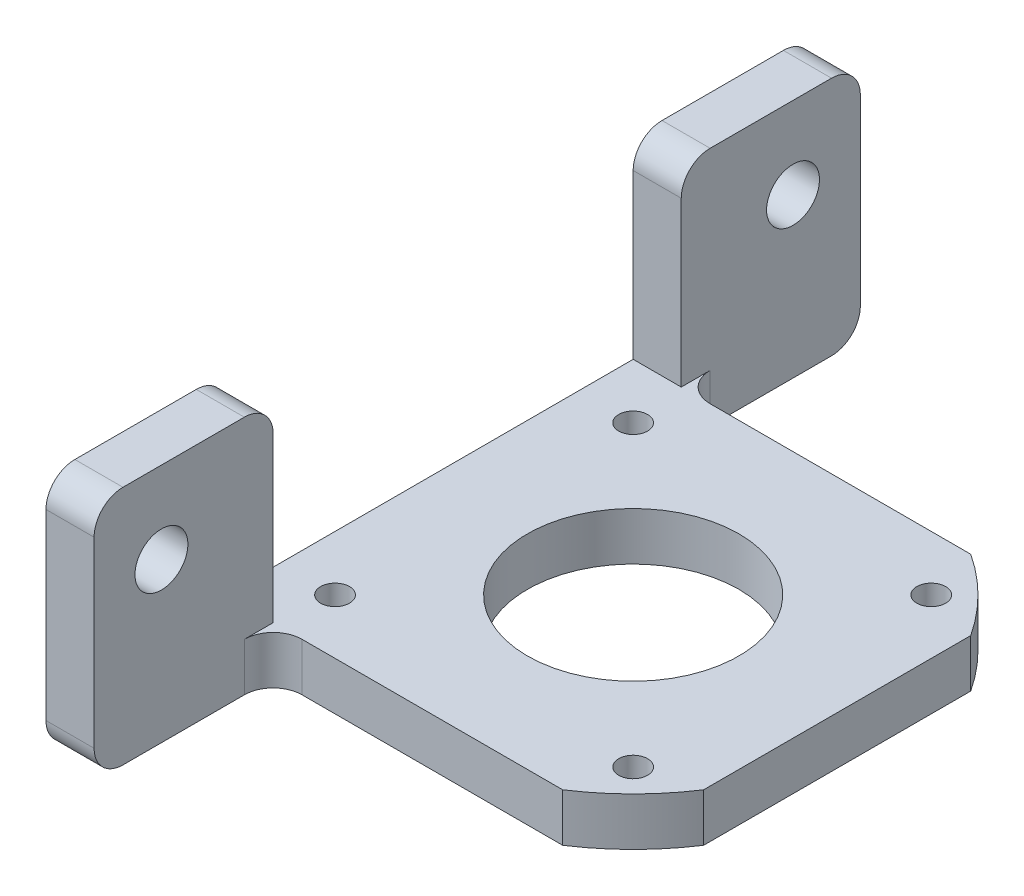
ISO-10303-21;
HEADER;
FILE_DESCRIPTION(('STEP AP214'),'2;1');
FILE_NAME('part.step','',(''),(''),'','','');
FILE_SCHEMA(('AUTOMOTIVE_DESIGN { 1 0 10303 214 1 1 1 1 }'));
ENDSEC;
DATA;
#1=APPLICATION_CONTEXT('core data for automotive mechanical design processes');
#2=APPLICATION_PROTOCOL_DEFINITION('international standard','automotive_design',2000,#1);
#3=PRODUCT_CONTEXT('',#1,'mechanical');
#4=PRODUCT('Part','Part','',(#3));
#5=PRODUCT_RELATED_PRODUCT_CATEGORY('part','',(#4));
#6=PRODUCT_DEFINITION_FORMATION('','',#4);
#7=PRODUCT_DEFINITION_CONTEXT('part definition',#1,'design');
#8=PRODUCT_DEFINITION('design','',#6,#7);
#9=PRODUCT_DEFINITION_SHAPE('','',#8);
#10=(LENGTH_UNIT() NAMED_UNIT(*) SI_UNIT(.MILLI.,.METRE.));
#11=(NAMED_UNIT(*) PLANE_ANGLE_UNIT() SI_UNIT($,.RADIAN.));
#12=(NAMED_UNIT(*) SI_UNIT($,.STERADIAN.) SOLID_ANGLE_UNIT());
#13=UNCERTAINTY_MEASURE_WITH_UNIT(LENGTH_MEASURE(1.E-05),#10,'distance_accuracy_value','');
#14=(GEOMETRIC_REPRESENTATION_CONTEXT(3) GLOBAL_UNCERTAINTY_ASSIGNED_CONTEXT((#13)) GLOBAL_UNIT_ASSIGNED_CONTEXT((#10,
#11,#12)) REPRESENTATION_CONTEXT('',''));
#15=CARTESIAN_POINT('',(0.,0.,0.));
#16=DIRECTION('',(0.,0.,1.));
#17=DIRECTION('',(1.,0.,0.));
#18=AXIS2_PLACEMENT_3D('',#15,#16,#17);
#19=CARTESIAN_POINT('',(-21.209,5.,-21.209));
#20=DIRECTION('',(0.,0.,-1.));
#21=DIRECTION('',(-1.,0.,0.));
#22=AXIS2_PLACEMENT_3D('',#19,#20,#21);
#23=PLANE('',#22);
#24=DIRECTION('',(1.,0.,0.));
#25=VECTOR('',#24,1.);
#26=CARTESIAN_POINT('',(-21.209,0.,-21.209));
#27=LINE('',#26,#25);
#28=CARTESIAN_POINT('',(-13.209,0.,-21.209));
#29=VERTEX_POINT('',#28);
#30=CARTESIAN_POINT('',(13.8838128639074,0.,-21.209));
#31=VERTEX_POINT('',#30);
#32=EDGE_CURVE('E308',#29,#31,#27,.T.);
#33=ORIENTED_EDGE('',*,*,#32,.F.);
#34=DIRECTION('',(0.,1.,0.));
#35=VECTOR('',#34,1.);
#36=CARTESIAN_POINT('',(-13.209,5.,-21.209));
#37=LINE('',#36,#35);
#38=CARTESIAN_POINT('',(-13.209,5.,-21.209));
#39=VERTEX_POINT('',#38);
#40=EDGE_CURVE('E338',#29,#39,#37,.T.);
#41=ORIENTED_EDGE('',*,*,#40,.T.);
#42=DIRECTION('',(-1.,0.,0.));
#43=VECTOR('',#42,1.);
#44=CARTESIAN_POINT('',(13.8838128639074,5.,-21.209));
#45=LINE('',#44,#43);
#46=CARTESIAN_POINT('',(13.8838128639074,5.,-21.209));
#47=VERTEX_POINT('',#46);
#48=EDGE_CURVE('E214',#47,#39,#45,.T.);
#49=ORIENTED_EDGE('',*,*,#48,.F.);
#50=DIRECTION('',(0.,-1.,0.));
#51=VECTOR('',#50,1.);
#52=CARTESIAN_POINT('',(13.8838128639074,5.,-21.209));
#53=LINE('',#52,#51);
#54=EDGE_CURVE('E334',#47,#31,#53,.T.);
#55=ORIENTED_EDGE('',*,*,#54,.T.);
#56=EDGE_LOOP('',(#33,#41,#49,#55));
#57=FACE_BOUND('',#56,.T.);
#58=ADVANCED_FACE('F39',(#57),#23,.T.);
#59=CARTESIAN_POINT('',(0.,5.,0.));
#60=DIRECTION('',(0.,-1.,0.));
#61=DIRECTION('',(0.,0.,-1.));
#62=AXIS2_PLACEMENT_3D('',#59,#60,#61);
#63=CYLINDRICAL_SURFACE('',#62,25.3492);
#64=CARTESIAN_POINT('',(0.,0.,0.));
#65=DIRECTION('',(0.,1.,0.));
#66=DIRECTION('',(0.,0.,1.));
#67=AXIS2_PLACEMENT_3D('',#64,#65,#66);
#68=CIRCLE('',#67,25.3492);
#69=CARTESIAN_POINT('',(21.209,0.,-13.8838128639074));
#70=VERTEX_POINT('',#69);
#71=EDGE_CURVE('E283',#70,#31,#68,.T.);
#72=ORIENTED_EDGE('',*,*,#71,.T.);
#73=ORIENTED_EDGE('',*,*,#54,.F.);
#74=CARTESIAN_POINT('',(0.,5.,0.));
#75=DIRECTION('',(0.,1.,0.));
#76=DIRECTION('',(0.,0.,1.));
#77=AXIS2_PLACEMENT_3D('',#74,#75,#76);
#78=CIRCLE('',#77,25.3492);
#79=CARTESIAN_POINT('',(21.209,5.,-13.8838128639074));
#80=VERTEX_POINT('',#79);
#81=EDGE_CURVE('E287',#80,#47,#78,.T.);
#82=ORIENTED_EDGE('',*,*,#81,.F.);
#83=DIRECTION('',(0.,-1.,0.));
#84=VECTOR('',#83,1.);
#85=CARTESIAN_POINT('',(21.209,5.,-13.8838128639074));
#86=LINE('',#85,#84);
#87=EDGE_CURVE('E304',#80,#70,#86,.T.);
#88=ORIENTED_EDGE('',*,*,#87,.T.);
#89=EDGE_LOOP('',(#72,#73,#82,#88));
#90=FACE_BOUND('',#89,.T.);
#91=ADVANCED_FACE('F486',(#90),#63,.T.);
#92=CARTESIAN_POINT('',(-21.209,5.,21.209));
#93=DIRECTION('',(-1.,0.,0.));
#94=DIRECTION('',(0.,0.,1.));
#95=AXIS2_PLACEMENT_3D('',#92,#93,#94);
#96=PLANE('',#95);
#97=CARTESIAN_POINT('',(-21.209,16.5,-32.829));
#98=DIRECTION('',(-1.,0.,0.));
#99=DIRECTION('',(0.,0.,1.));
#100=AXIS2_PLACEMENT_3D('',#97,#98,#99);
#101=CIRCLE('',#100,2.75);
#102=CARTESIAN_POINT('',(-21.209,16.5,-30.079));
#103=VERTEX_POINT('',#102);
#104=EDGE_CURVE('E551',#103,#103,#101,.T.);
#105=ORIENTED_EDGE('',*,*,#104,.F.);
#106=EDGE_LOOP('',(#105));
#107=FACE_BOUND('',#106,.T.);
#108=CARTESIAN_POINT('',(-21.209,16.5,32.829));
#109=DIRECTION('',(-1.,0.,0.));
#110=DIRECTION('',(0.,0.,1.));
#111=AXIS2_PLACEMENT_3D('',#108,#109,#110);
#112=CIRCLE('',#111,2.75);
#113=CARTESIAN_POINT('',(-21.209,16.5,35.579));
#114=VERTEX_POINT('',#113);
#115=EDGE_CURVE('E228',#114,#114,#112,.F.);
#116=ORIENTED_EDGE('',*,*,#115,.T.);
#117=EDGE_LOOP('',(#116));
#118=FACE_BOUND('',#117,.T.);
#119=DIRECTION('',(0.,-1.,0.));
#120=VECTOR('',#119,1.);
#121=CARTESIAN_POINT('',(-21.209,25.,-21.209));
#122=LINE('',#121,#120);
#123=CARTESIAN_POINT('',(-21.209,22.,-21.209));
#124=VERTEX_POINT('',#123);
#125=CARTESIAN_POINT('',(-21.209,5.,-21.209));
#126=VERTEX_POINT('',#125);
#127=EDGE_CURVE('E541',#124,#126,#122,.T.);
#128=ORIENTED_EDGE('',*,*,#127,.F.);
#129=CARTESIAN_POINT('',(-21.209,22.,-24.209));
#130=DIRECTION('',(-1.,0.,0.));
#131=DIRECTION('',(0.,0.,1.));
#132=AXIS2_PLACEMENT_3D('',#129,#130,#131);
#133=CIRCLE('',#132,3.);
#134=CARTESIAN_POINT('',(-21.209,25.,-24.209));
#135=VERTEX_POINT('',#134);
#136=EDGE_CURVE('E393',#124,#135,#133,.T.);
#137=ORIENTED_EDGE('',*,*,#136,.T.);
#138=DIRECTION('',(0.,0.,-1.));
#139=VECTOR('',#138,1.);
#140=CARTESIAN_POINT('',(-21.209,25.,-21.209));
#141=LINE('',#140,#139);
#142=CARTESIAN_POINT('',(-21.209,25.,-36.829));
#143=VERTEX_POINT('',#142);
#144=EDGE_CURVE('E547',#135,#143,#141,.T.);
#145=ORIENTED_EDGE('',*,*,#144,.T.);
#146=CARTESIAN_POINT('',(-21.209,22.,-36.829));
#147=DIRECTION('',(-1.,0.,0.));
#148=DIRECTION('',(0.,0.,1.));
#149=AXIS2_PLACEMENT_3D('',#146,#147,#148);
#150=CIRCLE('',#149,3.);
#151=CARTESIAN_POINT('',(-21.209,22.,-39.829));
#152=VERTEX_POINT('',#151);
#153=EDGE_CURVE('E390',#143,#152,#150,.T.);
#154=ORIENTED_EDGE('',*,*,#153,.T.);
#155=DIRECTION('',(0.,-1.,0.));
#156=VECTOR('',#155,1.);
#157=CARTESIAN_POINT('',(-21.209,5.,-39.829));
#158=LINE('',#157,#156);
#159=CARTESIAN_POINT('',(-21.209,3.,-39.829));
#160=VERTEX_POINT('',#159);
#161=EDGE_CURVE('E521',#152,#160,#158,.T.);
#162=ORIENTED_EDGE('',*,*,#161,.T.);
#163=CARTESIAN_POINT('',(-21.209,3.,-36.829));
#164=DIRECTION('',(-1.,0.,0.));
#165=DIRECTION('',(0.,0.,1.));
#166=AXIS2_PLACEMENT_3D('',#163,#164,#165);
#167=CIRCLE('',#166,3.);
#168=CARTESIAN_POINT('',(-21.209,0.,-36.829));
#169=VERTEX_POINT('',#168);
#170=EDGE_CURVE('E387',#160,#169,#167,.T.);
#171=ORIENTED_EDGE('',*,*,#170,.T.);
#172=DIRECTION('',(0.,0.,-1.));
#173=VECTOR('',#172,1.);
#174=CARTESIAN_POINT('',(-21.209,0.,21.209));
#175=LINE('',#174,#173);
#176=CARTESIAN_POINT('',(-21.209,0.,36.829));
#177=VERTEX_POINT('',#176);
#178=EDGE_CURVE('E311',#177,#169,#175,.T.);
#179=ORIENTED_EDGE('',*,*,#178,.F.);
#180=CARTESIAN_POINT('',(-21.209,3.,36.829));
#181=DIRECTION('',(-1.,0.,0.));
#182=DIRECTION('',(0.,0.,1.));
#183=AXIS2_PLACEMENT_3D('',#180,#181,#182);
#184=CIRCLE('',#183,3.);
#185=CARTESIAN_POINT('',(-21.209,3.,39.829));
#186=VERTEX_POINT('',#185);
#187=EDGE_CURVE('E384',#177,#186,#184,.T.);
#188=ORIENTED_EDGE('',*,*,#187,.T.);
#189=DIRECTION('',(0.,-1.,0.));
#190=VECTOR('',#189,1.);
#191=CARTESIAN_POINT('',(-21.209,5.,39.829));
#192=LINE('',#191,#190);
#193=CARTESIAN_POINT('',(-21.209,22.,39.829));
#194=VERTEX_POINT('',#193);
#195=EDGE_CURVE('E234',#194,#186,#192,.T.);
#196=ORIENTED_EDGE('',*,*,#195,.F.);
#197=CARTESIAN_POINT('',(-21.209,22.,36.829));
#198=DIRECTION('',(-1.,0.,0.));
#199=DIRECTION('',(0.,0.,1.));
#200=AXIS2_PLACEMENT_3D('',#197,#198,#199);
#201=CIRCLE('',#200,3.);
#202=CARTESIAN_POINT('',(-21.209,25.,36.829));
#203=VERTEX_POINT('',#202);
#204=EDGE_CURVE('E379',#194,#203,#201,.T.);
#205=ORIENTED_EDGE('',*,*,#204,.T.);
#206=DIRECTION('',(0.,0.,1.));
#207=VECTOR('',#206,1.);
#208=CARTESIAN_POINT('',(-21.209,25.,21.209));
#209=LINE('',#208,#207);
#210=CARTESIAN_POINT('',(-21.209,25.,24.209));
#211=VERTEX_POINT('',#210);
#212=EDGE_CURVE('E203',#211,#203,#209,.T.);
#213=ORIENTED_EDGE('',*,*,#212,.F.);
#214=CARTESIAN_POINT('',(-21.209,22.,24.209));
#215=DIRECTION('',(-1.,0.,0.));
#216=DIRECTION('',(0.,0.,1.));
#217=AXIS2_PLACEMENT_3D('',#214,#215,#216);
#218=CIRCLE('',#217,3.);
#219=CARTESIAN_POINT('',(-21.209,22.,21.209));
#220=VERTEX_POINT('',#219);
#221=EDGE_CURVE('E197',#211,#220,#218,.T.);
#222=ORIENTED_EDGE('',*,*,#221,.T.);
#223=DIRECTION('',(0.,-1.,0.));
#224=VECTOR('',#223,1.);
#225=CARTESIAN_POINT('',(-21.209,25.,21.209));
#226=LINE('',#225,#224);
#227=CARTESIAN_POINT('',(-21.209,5.,21.209));
#228=VERTEX_POINT('',#227);
#229=EDGE_CURVE('E191',#220,#228,#226,.T.);
#230=ORIENTED_EDGE('',*,*,#229,.T.);
#231=DIRECTION('',(0.,0.,-1.));
#232=VECTOR('',#231,1.);
#233=CARTESIAN_POINT('',(-21.209,5.,-13.8838128639074));
#234=LINE('',#233,#232);
#235=EDGE_CURVE('E195',#228,#126,#234,.T.);
#236=ORIENTED_EDGE('',*,*,#235,.T.);
#237=EDGE_LOOP('',(#128,#137,#145,#154,#162,#171,#179,#188,#196,#205,#213,#222,#230,#236));
#238=FACE_BOUND('',#237,.T.);
#239=ADVANCED_FACE('F194',(#107,#118,#238),#96,.T.);
#240=CARTESIAN_POINT('',(13.8838128639074,5.,21.209));
#241=DIRECTION('',(0.,0.,1.));
#242=DIRECTION('',(1.,0.,0.));
#243=AXIS2_PLACEMENT_3D('',#240,#241,#242);
#244=PLANE('',#243);
#245=DIRECTION('',(-1.,0.,0.));
#246=VECTOR('',#245,1.);
#247=CARTESIAN_POINT('',(-13.8838128639074,5.,21.209));
#248=LINE('',#247,#246);
#249=CARTESIAN_POINT('',(13.8838128639074,5.,21.209));
#250=VERTEX_POINT('',#249);
#251=CARTESIAN_POINT('',(-13.209,5.,21.209));
#252=VERTEX_POINT('',#251);
#253=EDGE_CURVE('E213',#250,#252,#248,.T.);
#254=ORIENTED_EDGE('',*,*,#253,.T.);
#255=DIRECTION('',(0.,1.,0.));
#256=VECTOR('',#255,1.);
#257=CARTESIAN_POINT('',(-13.209,5.,21.209));
#258=LINE('',#257,#256);
#259=CARTESIAN_POINT('',(-13.209,0.,21.209));
#260=VERTEX_POINT('',#259);
#261=EDGE_CURVE('E372',#252,#260,#258,.F.);
#262=ORIENTED_EDGE('',*,*,#261,.T.);
#263=DIRECTION('',(-1.,0.,0.));
#264=VECTOR('',#263,1.);
#265=CARTESIAN_POINT('',(13.8838128639074,0.,21.209));
#266=LINE('',#265,#264);
#267=CARTESIAN_POINT('',(13.8838128639074,0.,21.209));
#268=VERTEX_POINT('',#267);
#269=EDGE_CURVE('E315',#268,#260,#266,.T.);
#270=ORIENTED_EDGE('',*,*,#269,.F.);
#271=DIRECTION('',(0.,-1.,0.));
#272=VECTOR('',#271,1.);
#273=CARTESIAN_POINT('',(13.8838128639074,5.,21.209));
#274=LINE('',#273,#272);
#275=EDGE_CURVE('E331',#250,#268,#274,.T.);
#276=ORIENTED_EDGE('',*,*,#275,.F.);
#277=EDGE_LOOP('',(#254,#262,#270,#276));
#278=FACE_BOUND('',#277,.T.);
#279=ADVANCED_FACE('F444',(#278),#244,.T.);
#280=CARTESIAN_POINT('',(0.,5.,0.));
#281=DIRECTION('',(0.,-1.,0.));
#282=DIRECTION('',(0.,0.,-1.));
#283=AXIS2_PLACEMENT_3D('',#280,#281,#282);
#284=CYLINDRICAL_SURFACE('',#283,25.3492);
#285=CARTESIAN_POINT('',(0.,0.,0.));
#286=DIRECTION('',(0.,1.,0.));
#287=DIRECTION('',(0.,0.,1.));
#288=AXIS2_PLACEMENT_3D('',#285,#286,#287);
#289=CIRCLE('',#288,25.3492);
#290=CARTESIAN_POINT('',(21.209,0.,13.8838128639074));
#291=VERTEX_POINT('',#290);
#292=EDGE_CURVE('E319',#268,#291,#289,.T.);
#293=ORIENTED_EDGE('',*,*,#292,.T.);
#294=DIRECTION('',(0.,-1.,0.));
#295=VECTOR('',#294,1.);
#296=CARTESIAN_POINT('',(21.209,5.,13.8838128639074));
#297=LINE('',#296,#295);
#298=CARTESIAN_POINT('',(21.209,5.,13.8838128639074));
#299=VERTEX_POINT('',#298);
#300=EDGE_CURVE('E327',#299,#291,#297,.T.);
#301=ORIENTED_EDGE('',*,*,#300,.F.);
#302=CARTESIAN_POINT('',(0.,5.,0.));
#303=DIRECTION('',(0.,1.,0.));
#304=DIRECTION('',(0.,0.,1.));
#305=AXIS2_PLACEMENT_3D('',#302,#303,#304);
#306=CIRCLE('',#305,25.3492);
#307=EDGE_CURVE('E298',#250,#299,#306,.T.);
#308=ORIENTED_EDGE('',*,*,#307,.F.);
#309=ORIENTED_EDGE('',*,*,#275,.T.);
#310=EDGE_LOOP('',(#293,#301,#308,#309));
#311=FACE_BOUND('',#310,.T.);
#312=ADVANCED_FACE('F626',(#311),#284,.T.);
#313=CARTESIAN_POINT('',(21.209,5.,13.8838128639074));
#314=DIRECTION('',(-1.,0.,0.));
#315=DIRECTION('',(0.,0.,1.));
#316=AXIS2_PLACEMENT_3D('',#313,#314,#315);
#317=PLANE('',#316);
#318=DIRECTION('',(0.,0.,-1.));
#319=VECTOR('',#318,1.);
#320=CARTESIAN_POINT('',(21.209,0.,13.8838128639074));
#321=LINE('',#320,#319);
#322=EDGE_CURVE('E291',#291,#70,#321,.T.);
#323=ORIENTED_EDGE('',*,*,#322,.T.);
#324=ORIENTED_EDGE('',*,*,#87,.F.);
#325=DIRECTION('',(0.,0.,-1.));
#326=VECTOR('',#325,1.);
#327=CARTESIAN_POINT('',(21.209,5.,13.8838128639074));
#328=LINE('',#327,#326);
#329=EDGE_CURVE('E301',#299,#80,#328,.T.);
#330=ORIENTED_EDGE('',*,*,#329,.F.);
#331=ORIENTED_EDGE('',*,*,#300,.T.);
#332=EDGE_LOOP('',(#323,#324,#330,#331));
#333=FACE_BOUND('',#332,.T.);
#334=ADVANCED_FACE('F620',(#333),#317,.F.);
#335=CARTESIAN_POINT('',(0.,5.,0.));
#336=DIRECTION('',(0.,1.,0.));
#337=DIRECTION('',(0.,0.,1.));
#338=AXIS2_PLACEMENT_3D('',#335,#336,#337);
#339=PLANE('',#338);
#340=DIRECTION('',(-1.,0.,0.));
#341=VECTOR('',#340,1.);
#342=CARTESIAN_POINT('',(-16.209,5.,-21.209));
#343=LINE('',#342,#341);
#344=CARTESIAN_POINT('',(-16.209,5.,-21.209));
#345=VERTEX_POINT('',#344);
#346=EDGE_CURVE('E211',#345,#126,#343,.T.);
#347=ORIENTED_EDGE('',*,*,#346,.T.);
#348=ORIENTED_EDGE('',*,*,#235,.F.);
#349=DIRECTION('',(-1.,0.,0.));
#350=VECTOR('',#349,1.);
#351=CARTESIAN_POINT('',(-16.209,5.,21.209));
#352=LINE('',#351,#350);
#353=CARTESIAN_POINT('',(-16.209,5.,21.209));
#354=VERTEX_POINT('',#353);
#355=EDGE_CURVE('E209',#354,#228,#352,.T.);
#356=ORIENTED_EDGE('',*,*,#355,.F.);
#357=DIRECTION('',(0.,0.,-1.));
#358=VECTOR('',#357,1.);
#359=CARTESIAN_POINT('',(-16.209,5.,39.829));
#360=LINE('',#359,#358);
#361=CARTESIAN_POINT('',(-16.209,5.,24.209));
#362=VERTEX_POINT('',#361);
#363=EDGE_CURVE('E365',#362,#354,#360,.T.);
#364=ORIENTED_EDGE('',*,*,#363,.F.);
#365=CARTESIAN_POINT('',(-13.209,5.,24.209));
#366=DIRECTION('',(0.,1.,0.));
#367=DIRECTION('',(0.,0.,1.));
#368=AXIS2_PLACEMENT_3D('',#365,#366,#367);
#369=CIRCLE('',#368,3.);
#370=EDGE_CURVE('E48',#362,#252,#369,.F.);
#371=ORIENTED_EDGE('',*,*,#370,.T.);
#372=ORIENTED_EDGE('',*,*,#253,.F.);
#373=ORIENTED_EDGE('',*,*,#307,.T.);
#374=ORIENTED_EDGE('',*,*,#329,.T.);
#375=ORIENTED_EDGE('',*,*,#81,.T.);
#376=ORIENTED_EDGE('',*,*,#48,.T.);
#377=CARTESIAN_POINT('',(-13.209,5.,-24.209));
#378=DIRECTION('',(0.,1.,0.));
#379=DIRECTION('',(0.,0.,1.));
#380=AXIS2_PLACEMENT_3D('',#377,#378,#379);
#381=CIRCLE('',#380,3.);
#382=CARTESIAN_POINT('',(-16.209,5.,-24.209));
#383=VERTEX_POINT('',#382);
#384=EDGE_CURVE('E433',#39,#383,#381,.F.);
#385=ORIENTED_EDGE('',*,*,#384,.T.);
#386=DIRECTION('',(0.,0.,-1.));
#387=VECTOR('',#386,1.);
#388=CARTESIAN_POINT('',(-16.209,5.,0.));
#389=LINE('',#388,#387);
#390=EDGE_CURVE('E55',#345,#383,#389,.T.);
#391=ORIENTED_EDGE('',*,*,#390,.F.);
#392=EDGE_LOOP('',(#347,#348,#356,#364,#371,#372,#373,#374,#375,#376,#385,#391));
#393=FACE_BOUND('',#392,.T.);
#394=CARTESIAN_POINT('',(0.,5.,0.));
#395=DIRECTION('',(0.,1.,0.));
#396=DIRECTION('',(0.,0.,1.));
#397=AXIS2_PLACEMENT_3D('',#394,#395,#396);
#398=CIRCLE('',#397,10.9982);
#399=CARTESIAN_POINT('',(0.,5.,10.9982));
#400=VERTEX_POINT('',#399);
#401=EDGE_CURVE('E272',#400,#400,#398,.T.);
#402=ORIENTED_EDGE('',*,*,#401,.F.);
#403=EDGE_LOOP('',(#402));
#404=FACE_BOUND('',#403,.T.);
#405=CARTESIAN_POINT('',(-15.494,5.,-15.494));
#406=DIRECTION('',(0.,1.,0.));
#407=DIRECTION('',(0.,0.,1.));
#408=AXIS2_PLACEMENT_3D('',#405,#406,#407);
#409=CIRCLE('',#408,1.5);
#410=CARTESIAN_POINT('',(-15.494,5.,-13.994));
#411=VERTEX_POINT('',#410);
#412=EDGE_CURVE('E264',#411,#411,#409,.T.);
#413=ORIENTED_EDGE('',*,*,#412,.F.);
#414=EDGE_LOOP('',(#413));
#415=FACE_BOUND('',#414,.T.);
#416=CARTESIAN_POINT('',(-15.494,5.,15.494));
#417=DIRECTION('',(0.,1.,0.));
#418=DIRECTION('',(0.,0.,1.));
#419=AXIS2_PLACEMENT_3D('',#416,#417,#418);
#420=CIRCLE('',#419,1.5);
#421=CARTESIAN_POINT('',(-15.494,5.,16.994));
#422=VERTEX_POINT('',#421);
#423=EDGE_CURVE('E256',#422,#422,#420,.T.);
#424=ORIENTED_EDGE('',*,*,#423,.F.);
#425=EDGE_LOOP('',(#424));
#426=FACE_BOUND('',#425,.T.);
#427=CARTESIAN_POINT('',(15.494,5.,15.494));
#428=DIRECTION('',(0.,1.,0.));
#429=DIRECTION('',(0.,0.,1.));
#430=AXIS2_PLACEMENT_3D('',#427,#428,#429);
#431=CIRCLE('',#430,1.5);
#432=CARTESIAN_POINT('',(15.494,5.,16.994));
#433=VERTEX_POINT('',#432);
#434=EDGE_CURVE('E247',#433,#433,#431,.T.);
#435=ORIENTED_EDGE('',*,*,#434,.F.);
#436=EDGE_LOOP('',(#435));
#437=FACE_BOUND('',#436,.T.);
#438=CARTESIAN_POINT('',(15.494,5.,-15.494));
#439=DIRECTION('',(0.,1.,0.));
#440=DIRECTION('',(0.,0.,1.));
#441=AXIS2_PLACEMENT_3D('',#438,#439,#440);
#442=CIRCLE('',#441,1.5);
#443=CARTESIAN_POINT('',(15.494,5.,-13.994));
#444=VERTEX_POINT('',#443);
#445=EDGE_CURVE('E279',#444,#444,#442,.T.);
#446=ORIENTED_EDGE('',*,*,#445,.F.);
#447=EDGE_LOOP('',(#446));
#448=FACE_BOUND('',#447,.T.);
#449=ADVANCED_FACE('F206',(#393,#404,#415,#426,#437,#448),#339,.T.);
#450=CARTESIAN_POINT('',(0.,0.,0.));
#451=DIRECTION('',(0.,1.,0.));
#452=DIRECTION('',(0.,0.,1.));
#453=AXIS2_PLACEMENT_3D('',#450,#451,#452);
#454=PLANE('',#453);
#455=CARTESIAN_POINT('',(0.,0.,0.));
#456=DIRECTION('',(0.,1.,0.));
#457=DIRECTION('',(0.,0.,1.));
#458=AXIS2_PLACEMENT_3D('',#455,#456,#457);
#459=CIRCLE('',#458,10.9982);
#460=CARTESIAN_POINT('',(0.,0.,10.9982));
#461=VERTEX_POINT('',#460);
#462=EDGE_CURVE('E246',#461,#461,#459,.T.);
#463=ORIENTED_EDGE('',*,*,#462,.T.);
#464=EDGE_LOOP('',(#463));
#465=FACE_BOUND('',#464,.T.);
#466=CARTESIAN_POINT('',(-15.494,0.,-15.494));
#467=DIRECTION('',(0.,1.,0.));
#468=DIRECTION('',(0.,0.,1.));
#469=AXIS2_PLACEMENT_3D('',#466,#467,#468);
#470=CIRCLE('',#469,1.5);
#471=CARTESIAN_POINT('',(-15.494,0.,-13.994));
#472=VERTEX_POINT('',#471);
#473=EDGE_CURVE('E268',#472,#472,#470,.T.);
#474=ORIENTED_EDGE('',*,*,#473,.T.);
#475=EDGE_LOOP('',(#474));
#476=FACE_BOUND('',#475,.T.);
#477=CARTESIAN_POINT('',(-15.494,0.,15.494));
#478=DIRECTION('',(0.,1.,0.));
#479=DIRECTION('',(0.,0.,1.));
#480=AXIS2_PLACEMENT_3D('',#477,#478,#479);
#481=CIRCLE('',#480,1.5);
#482=CARTESIAN_POINT('',(-15.494,0.,16.994));
#483=VERTEX_POINT('',#482);
#484=EDGE_CURVE('E260',#483,#483,#481,.T.);
#485=ORIENTED_EDGE('',*,*,#484,.T.);
#486=EDGE_LOOP('',(#485));
#487=FACE_BOUND('',#486,.T.);
#488=CARTESIAN_POINT('',(15.494,0.,15.494));
#489=DIRECTION('',(0.,1.,0.));
#490=DIRECTION('',(0.,0.,1.));
#491=AXIS2_PLACEMENT_3D('',#488,#489,#490);
#492=CIRCLE('',#491,1.5);
#493=CARTESIAN_POINT('',(15.494,0.,16.994));
#494=VERTEX_POINT('',#493);
#495=EDGE_CURVE('E252',#494,#494,#492,.T.);
#496=ORIENTED_EDGE('',*,*,#495,.T.);
#497=EDGE_LOOP('',(#496));
#498=FACE_BOUND('',#497,.T.);
#499=CARTESIAN_POINT('',(15.494,0.,-15.494));
#500=DIRECTION('',(0.,1.,0.));
#501=DIRECTION('',(0.,0.,1.));
#502=AXIS2_PLACEMENT_3D('',#499,#500,#501);
#503=CIRCLE('',#502,1.5);
#504=CARTESIAN_POINT('',(15.494,0.,-13.994));
#505=VERTEX_POINT('',#504);
#506=EDGE_CURVE('E251',#505,#505,#503,.T.);
#507=ORIENTED_EDGE('',*,*,#506,.T.);
#508=EDGE_LOOP('',(#507));
#509=FACE_BOUND('',#508,.T.);
#510=ORIENTED_EDGE('',*,*,#178,.T.);
#511=DIRECTION('',(1.,0.,0.));
#512=VECTOR('',#511,1.);
#513=CARTESIAN_POINT('',(-16.209,0.,-36.829));
#514=LINE('',#513,#512);
#515=CARTESIAN_POINT('',(-16.209,0.,-36.829));
#516=VERTEX_POINT('',#515);
#517=EDGE_CURVE('E411',#169,#516,#514,.T.);
#518=ORIENTED_EDGE('',*,*,#517,.T.);
#519=DIRECTION('',(0.,0.,1.));
#520=VECTOR('',#519,1.);
#521=CARTESIAN_POINT('',(-16.209,0.,-39.829));
#522=LINE('',#521,#520);
#523=CARTESIAN_POINT('',(-16.209,0.,-24.209));
#524=VERTEX_POINT('',#523);
#525=EDGE_CURVE('E524',#516,#524,#522,.T.);
#526=ORIENTED_EDGE('',*,*,#525,.T.);
#527=CARTESIAN_POINT('',(-13.209,0.,-24.209));
#528=DIRECTION('',(0.,1.,0.));
#529=DIRECTION('',(0.,0.,1.));
#530=AXIS2_PLACEMENT_3D('',#527,#528,#529);
#531=CIRCLE('',#530,3.);
#532=EDGE_CURVE('E436',#524,#29,#531,.T.);
#533=ORIENTED_EDGE('',*,*,#532,.T.);
#534=ORIENTED_EDGE('',*,*,#32,.T.);
#535=ORIENTED_EDGE('',*,*,#71,.F.);
#536=ORIENTED_EDGE('',*,*,#322,.F.);
#537=ORIENTED_EDGE('',*,*,#292,.F.);
#538=ORIENTED_EDGE('',*,*,#269,.T.);
#539=CARTESIAN_POINT('',(-13.209,0.,24.209));
#540=DIRECTION('',(0.,1.,0.));
#541=DIRECTION('',(0.,0.,1.));
#542=AXIS2_PLACEMENT_3D('',#539,#540,#541);
#543=CIRCLE('',#542,3.);
#544=CARTESIAN_POINT('',(-16.209,0.,24.209));
#545=VERTEX_POINT('',#544);
#546=EDGE_CURVE('E11',#260,#545,#543,.T.);
#547=ORIENTED_EDGE('',*,*,#546,.T.);
#548=DIRECTION('',(0.,0.,-1.));
#549=VECTOR('',#548,1.);
#550=CARTESIAN_POINT('',(-16.209,0.,39.829));
#551=LINE('',#550,#549);
#552=CARTESIAN_POINT('',(-16.209,0.,36.829));
#553=VERTEX_POINT('',#552);
#554=EDGE_CURVE('E242',#553,#545,#551,.T.);
#555=ORIENTED_EDGE('',*,*,#554,.F.);
#556=DIRECTION('',(1.,0.,0.));
#557=VECTOR('',#556,1.);
#558=CARTESIAN_POINT('',(-21.209,0.,36.829));
#559=LINE('',#558,#557);
#560=EDGE_CURVE('E408',#553,#177,#559,.F.);
#561=ORIENTED_EDGE('',*,*,#560,.T.);
#562=EDGE_LOOP('',(#510,#518,#526,#533,#534,#535,#536,#537,#538,#547,#555,#561));
#563=FACE_BOUND('',#562,.T.);
#564=ADVANCED_FACE('F451',(#465,#476,#487,#498,#509,#563),#454,.F.);
#565=CARTESIAN_POINT('',(15.494,5.,-15.494));
#566=DIRECTION('',(0.,-1.,0.));
#567=DIRECTION('',(0.,0.,-1.));
#568=AXIS2_PLACEMENT_3D('',#565,#566,#567);
#569=CYLINDRICAL_SURFACE('',#568,1.5);
#570=ORIENTED_EDGE('',*,*,#445,.T.);
#571=EDGE_LOOP('',(#570));
#572=FACE_BOUND('',#571,.T.);
#573=ORIENTED_EDGE('',*,*,#506,.F.);
#574=EDGE_LOOP('',(#573));
#575=FACE_BOUND('',#574,.T.);
#576=ADVANCED_FACE('F603',(#572,#575),#569,.F.);
#577=CARTESIAN_POINT('',(15.494,5.,15.494));
#578=DIRECTION('',(0.,-1.,0.));
#579=DIRECTION('',(0.,0.,-1.));
#580=AXIS2_PLACEMENT_3D('',#577,#578,#579);
#581=CYLINDRICAL_SURFACE('',#580,1.5);
#582=ORIENTED_EDGE('',*,*,#434,.T.);
#583=EDGE_LOOP('',(#582));
#584=FACE_BOUND('',#583,.T.);
#585=ORIENTED_EDGE('',*,*,#495,.F.);
#586=EDGE_LOOP('',(#585));
#587=FACE_BOUND('',#586,.T.);
#588=ADVANCED_FACE('F599',(#584,#587),#581,.F.);
#589=CARTESIAN_POINT('',(-15.494,5.,15.494));
#590=DIRECTION('',(0.,-1.,0.));
#591=DIRECTION('',(0.,0.,-1.));
#592=AXIS2_PLACEMENT_3D('',#589,#590,#591);
#593=CYLINDRICAL_SURFACE('',#592,1.5);
#594=ORIENTED_EDGE('',*,*,#423,.T.);
#595=EDGE_LOOP('',(#594));
#596=FACE_BOUND('',#595,.T.);
#597=ORIENTED_EDGE('',*,*,#484,.F.);
#598=EDGE_LOOP('',(#597));
#599=FACE_BOUND('',#598,.T.);
#600=ADVANCED_FACE('F602',(#596,#599),#593,.F.);
#601=CARTESIAN_POINT('',(-15.494,5.,-15.494));
#602=DIRECTION('',(0.,-1.,0.));
#603=DIRECTION('',(0.,0.,-1.));
#604=AXIS2_PLACEMENT_3D('',#601,#602,#603);
#605=CYLINDRICAL_SURFACE('',#604,1.5);
#606=ORIENTED_EDGE('',*,*,#412,.T.);
#607=EDGE_LOOP('',(#606));
#608=FACE_BOUND('',#607,.T.);
#609=ORIENTED_EDGE('',*,*,#473,.F.);
#610=EDGE_LOOP('',(#609));
#611=FACE_BOUND('',#610,.T.);
#612=ADVANCED_FACE('F607',(#608,#611),#605,.F.);
#613=CARTESIAN_POINT('',(0.,5.,0.));
#614=DIRECTION('',(0.,-1.,0.));
#615=DIRECTION('',(0.,0.,-1.));
#616=AXIS2_PLACEMENT_3D('',#613,#614,#615);
#617=CYLINDRICAL_SURFACE('',#616,10.9982);
#618=ORIENTED_EDGE('',*,*,#401,.T.);
#619=EDGE_LOOP('',(#618));
#620=FACE_BOUND('',#619,.T.);
#621=ORIENTED_EDGE('',*,*,#462,.F.);
#622=EDGE_LOOP('',(#621));
#623=FACE_BOUND('',#622,.T.);
#624=ADVANCED_FACE('F597',(#620,#623),#617,.F.);
#625=CARTESIAN_POINT('',(-16.209,0.,39.829));
#626=DIRECTION('',(-1.,0.,0.));
#627=DIRECTION('',(0.,0.,1.));
#628=AXIS2_PLACEMENT_3D('',#625,#626,#627);
#629=PLANE('',#628);
#630=CARTESIAN_POINT('',(-16.209,16.5,32.829));
#631=DIRECTION('',(1.,0.,0.));
#632=DIRECTION('',(0.,0.,-1.));
#633=AXIS2_PLACEMENT_3D('',#630,#631,#632);
#634=CIRCLE('',#633,2.75);
#635=CARTESIAN_POINT('',(-16.209,16.5,30.079));
#636=VERTEX_POINT('',#635);
#637=EDGE_CURVE('E221',#636,#636,#634,.T.);
#638=ORIENTED_EDGE('',*,*,#637,.F.);
#639=EDGE_LOOP('',(#638));
#640=FACE_BOUND('',#639,.T.);
#641=ORIENTED_EDGE('',*,*,#554,.T.);
#642=DIRECTION('',(0.,1.,0.));
#643=VECTOR('',#642,1.);
#644=CARTESIAN_POINT('',(-16.209,0.,24.209));
#645=LINE('',#644,#643);
#646=EDGE_CURVE('E368',#545,#362,#645,.T.);
#647=ORIENTED_EDGE('',*,*,#646,.T.);
#648=ORIENTED_EDGE('',*,*,#363,.T.);
#649=DIRECTION('',(0.,-1.,0.));
#650=VECTOR('',#649,1.);
#651=CARTESIAN_POINT('',(-16.209,25.,21.209));
#652=LINE('',#651,#650);
#653=CARTESIAN_POINT('',(-16.209,22.,21.209));
#654=VERTEX_POINT('',#653);
#655=EDGE_CURVE('E202',#654,#354,#652,.T.);
#656=ORIENTED_EDGE('',*,*,#655,.F.);
#657=CARTESIAN_POINT('',(-16.209,22.,24.209));
#658=DIRECTION('',(-1.,0.,0.));
#659=DIRECTION('',(0.,0.,1.));
#660=AXIS2_PLACEMENT_3D('',#657,#658,#659);
#661=CIRCLE('',#660,3.);
#662=CARTESIAN_POINT('',(-16.209,25.,24.209));
#663=VERTEX_POINT('',#662);
#664=EDGE_CURVE('E359',#654,#663,#661,.F.);
#665=ORIENTED_EDGE('',*,*,#664,.T.);
#666=DIRECTION('',(0.,0.,-1.));
#667=VECTOR('',#666,1.);
#668=CARTESIAN_POINT('',(-16.209,25.,39.829));
#669=LINE('',#668,#667);
#670=CARTESIAN_POINT('',(-16.209,25.,36.829));
#671=VERTEX_POINT('',#670);
#672=EDGE_CURVE('E220',#671,#663,#669,.T.);
#673=ORIENTED_EDGE('',*,*,#672,.F.);
#674=CARTESIAN_POINT('',(-16.209,22.,36.829));
#675=DIRECTION('',(-1.,0.,0.));
#676=DIRECTION('',(0.,0.,1.));
#677=AXIS2_PLACEMENT_3D('',#674,#675,#676);
#678=CIRCLE('',#677,3.);
#679=CARTESIAN_POINT('',(-16.209,22.,39.829));
#680=VERTEX_POINT('',#679);
#681=EDGE_CURVE('E356',#671,#680,#678,.F.);
#682=ORIENTED_EDGE('',*,*,#681,.T.);
#683=DIRECTION('',(0.,1.,0.));
#684=VECTOR('',#683,1.);
#685=CARTESIAN_POINT('',(-16.209,0.,39.829));
#686=LINE('',#685,#684);
#687=CARTESIAN_POINT('',(-16.209,3.,39.829));
#688=VERTEX_POINT('',#687);
#689=EDGE_CURVE('E238',#688,#680,#686,.T.);
#690=ORIENTED_EDGE('',*,*,#689,.F.);
#691=CARTESIAN_POINT('',(-16.209,3.,36.829));
#692=DIRECTION('',(-1.,0.,0.));
#693=DIRECTION('',(0.,0.,1.));
#694=AXIS2_PLACEMENT_3D('',#691,#692,#693);
#695=CIRCLE('',#694,3.);
#696=EDGE_CURVE('E362',#688,#553,#695,.F.);
#697=ORIENTED_EDGE('',*,*,#696,.T.);
#698=EDGE_LOOP('',(#641,#647,#648,#656,#665,#673,#682,#690,#697));
#699=FACE_BOUND('',#698,.T.);
#700=ADVANCED_FACE('F455',(#640,#699),#629,.F.);
#701=CARTESIAN_POINT('',(0.,0.,39.829));
#702=DIRECTION('',(0.,0.,1.));
#703=DIRECTION('',(1.,0.,0.));
#704=AXIS2_PLACEMENT_3D('',#701,#702,#703);
#705=PLANE('',#704);
#706=ORIENTED_EDGE('',*,*,#195,.T.);
#707=DIRECTION('',(1.,0.,0.));
#708=VECTOR('',#707,1.);
#709=CARTESIAN_POINT('',(-16.209,3.,39.829));
#710=LINE('',#709,#708);
#711=EDGE_CURVE('E418',#186,#688,#710,.T.);
#712=ORIENTED_EDGE('',*,*,#711,.T.);
#713=ORIENTED_EDGE('',*,*,#689,.T.);
#714=DIRECTION('',(1.,0.,0.));
#715=VECTOR('',#714,1.);
#716=CARTESIAN_POINT('',(0.,22.,39.829));
#717=LINE('',#716,#715);
#718=EDGE_CURVE('E415',#680,#194,#717,.F.);
#719=ORIENTED_EDGE('',*,*,#718,.T.);
#720=EDGE_LOOP('',(#706,#712,#713,#719));
#721=FACE_BOUND('',#720,.T.);
#722=ADVANCED_FACE('F462',(#721),#705,.T.);
#723=CARTESIAN_POINT('',(-16.209,25.,21.209));
#724=DIRECTION('',(0.,0.,1.));
#725=DIRECTION('',(1.,0.,0.));
#726=AXIS2_PLACEMENT_3D('',#723,#724,#725);
#727=PLANE('',#726);
#728=ORIENTED_EDGE('',*,*,#229,.F.);
#729=DIRECTION('',(-1.,0.,0.));
#730=VECTOR('',#729,1.);
#731=CARTESIAN_POINT('',(-16.209,22.,21.209));
#732=LINE('',#731,#730);
#733=EDGE_CURVE('E430',#220,#654,#732,.F.);
#734=ORIENTED_EDGE('',*,*,#733,.T.);
#735=ORIENTED_EDGE('',*,*,#655,.T.);
#736=ORIENTED_EDGE('',*,*,#355,.T.);
#737=EDGE_LOOP('',(#728,#734,#735,#736));
#738=FACE_BOUND('',#737,.T.);
#739=ADVANCED_FACE('F217',(#738),#727,.F.);
#740=CARTESIAN_POINT('',(0.,25.,0.));
#741=DIRECTION('',(0.,1.,0.));
#742=DIRECTION('',(0.,0.,1.));
#743=AXIS2_PLACEMENT_3D('',#740,#741,#742);
#744=PLANE('',#743);
#745=ORIENTED_EDGE('',*,*,#672,.T.);
#746=DIRECTION('',(-1.,0.,0.));
#747=VECTOR('',#746,1.);
#748=CARTESIAN_POINT('',(-21.209,25.,24.209));
#749=LINE('',#748,#747);
#750=EDGE_CURVE('E426',#663,#211,#749,.T.);
#751=ORIENTED_EDGE('',*,*,#750,.T.);
#752=ORIENTED_EDGE('',*,*,#212,.T.);
#753=DIRECTION('',(1.,0.,0.));
#754=VECTOR('',#753,1.);
#755=CARTESIAN_POINT('',(0.,25.,36.829));
#756=LINE('',#755,#754);
#757=EDGE_CURVE('E422',#203,#671,#756,.T.);
#758=ORIENTED_EDGE('',*,*,#757,.T.);
#759=EDGE_LOOP('',(#745,#751,#752,#758));
#760=FACE_BOUND('',#759,.T.);
#761=ADVANCED_FACE('F472',(#760),#744,.T.);
#762=CARTESIAN_POINT('',(-21.21,16.5,32.829));
#763=DIRECTION('',(1.,0.,0.));
#764=DIRECTION('',(0.,0.,-1.));
#765=AXIS2_PLACEMENT_3D('',#762,#763,#764);
#766=CYLINDRICAL_SURFACE('',#765,2.75);
#767=ORIENTED_EDGE('',*,*,#115,.F.);
#768=EDGE_LOOP('',(#767));
#769=FACE_BOUND('',#768,.T.);
#770=ORIENTED_EDGE('',*,*,#637,.T.);
#771=EDGE_LOOP('',(#770));
#772=FACE_BOUND('',#771,.T.);
#773=ADVANCED_FACE('F585',(#769,#772),#766,.F.);
#774=CARTESIAN_POINT('',(-16.209,0.,-39.829));
#775=DIRECTION('',(1.,0.,0.));
#776=DIRECTION('',(0.,0.,-1.));
#777=AXIS2_PLACEMENT_3D('',#774,#775,#776);
#778=PLANE('',#777);
#779=CARTESIAN_POINT('',(-16.209,16.5,-32.829));
#780=DIRECTION('',(-1.,0.,0.));
#781=DIRECTION('',(0.,0.,1.));
#782=AXIS2_PLACEMENT_3D('',#779,#780,#781);
#783=CIRCLE('',#782,2.75);
#784=CARTESIAN_POINT('',(-16.209,16.5,-30.079));
#785=VERTEX_POINT('',#784);
#786=EDGE_CURVE('E561',#785,#785,#783,.T.);
#787=ORIENTED_EDGE('',*,*,#786,.T.);
#788=EDGE_LOOP('',(#787));
#789=FACE_BOUND('',#788,.T.);
#790=DIRECTION('',(0.,-1.,0.));
#791=VECTOR('',#790,1.);
#792=CARTESIAN_POINT('',(-16.209,25.,-21.209));
#793=LINE('',#792,#791);
#794=CARTESIAN_POINT('',(-16.209,22.,-21.209));
#795=VERTEX_POINT('',#794);
#796=EDGE_CURVE('E544',#795,#345,#793,.T.);
#797=ORIENTED_EDGE('',*,*,#796,.T.);
#798=ORIENTED_EDGE('',*,*,#390,.T.);
#799=DIRECTION('',(0.,1.,0.));
#800=VECTOR('',#799,1.);
#801=CARTESIAN_POINT('',(-16.209,0.,-24.209));
#802=LINE('',#801,#800);
#803=EDGE_CURVE('E351',#383,#524,#802,.F.);
#804=ORIENTED_EDGE('',*,*,#803,.T.);
#805=ORIENTED_EDGE('',*,*,#525,.F.);
#806=CARTESIAN_POINT('',(-16.209,3.,-36.829));
#807=DIRECTION('',(1.,0.,0.));
#808=DIRECTION('',(0.,0.,-1.));
#809=AXIS2_PLACEMENT_3D('',#806,#807,#808);
#810=CIRCLE('',#809,3.);
#811=CARTESIAN_POINT('',(-16.209,3.,-39.829));
#812=VERTEX_POINT('',#811);
#813=EDGE_CURVE('E342',#516,#812,#810,.T.);
#814=ORIENTED_EDGE('',*,*,#813,.T.);
#815=DIRECTION('',(0.,1.,0.));
#816=VECTOR('',#815,1.);
#817=CARTESIAN_POINT('',(-16.209,0.,-39.829));
#818=LINE('',#817,#816);
#819=CARTESIAN_POINT('',(-16.209,22.,-39.829));
#820=VERTEX_POINT('',#819);
#821=EDGE_CURVE('E536',#812,#820,#818,.T.);
#822=ORIENTED_EDGE('',*,*,#821,.T.);
#823=CARTESIAN_POINT('',(-16.209,22.,-36.829));
#824=DIRECTION('',(1.,0.,0.));
#825=DIRECTION('',(0.,0.,-1.));
#826=AXIS2_PLACEMENT_3D('',#823,#824,#825);
#827=CIRCLE('',#826,3.);
#828=CARTESIAN_POINT('',(-16.209,25.,-36.829));
#829=VERTEX_POINT('',#828);
#830=EDGE_CURVE('E345',#820,#829,#827,.T.);
#831=ORIENTED_EDGE('',*,*,#830,.T.);
#832=DIRECTION('',(0.,0.,1.));
#833=VECTOR('',#832,1.);
#834=CARTESIAN_POINT('',(-16.209,25.,-39.829));
#835=LINE('',#834,#833);
#836=CARTESIAN_POINT('',(-16.209,25.,-24.209));
#837=VERTEX_POINT('',#836);
#838=EDGE_CURVE('E550',#829,#837,#835,.T.);
#839=ORIENTED_EDGE('',*,*,#838,.T.);
#840=CARTESIAN_POINT('',(-16.209,22.,-24.209));
#841=DIRECTION('',(1.,0.,0.));
#842=DIRECTION('',(0.,0.,-1.));
#843=AXIS2_PLACEMENT_3D('',#840,#841,#842);
#844=CIRCLE('',#843,3.);
#845=EDGE_CURVE('E348',#837,#795,#844,.T.);
#846=ORIENTED_EDGE('',*,*,#845,.T.);
#847=EDGE_LOOP('',(#797,#798,#804,#805,#814,#822,#831,#839,#846));
#848=FACE_BOUND('',#847,.T.);
#849=ADVANCED_FACE('F527',(#789,#848),#778,.T.);
#850=CARTESIAN_POINT('',(0.,0.,-39.829));
#851=DIRECTION('',(0.,0.,-1.));
#852=DIRECTION('',(1.,0.,0.));
#853=AXIS2_PLACEMENT_3D('',#850,#851,#852);
#854=PLANE('',#853);
#855=ORIENTED_EDGE('',*,*,#161,.F.);
#856=DIRECTION('',(1.,0.,0.));
#857=VECTOR('',#856,1.);
#858=CARTESIAN_POINT('',(0.,22.,-39.829));
#859=LINE('',#858,#857);
#860=EDGE_CURVE('E404',#152,#820,#859,.T.);
#861=ORIENTED_EDGE('',*,*,#860,.T.);
#862=ORIENTED_EDGE('',*,*,#821,.F.);
#863=DIRECTION('',(1.,0.,0.));
#864=VECTOR('',#863,1.);
#865=CARTESIAN_POINT('',(-21.209,3.,-39.829));
#866=LINE('',#865,#864);
#867=EDGE_CURVE('E63',#812,#160,#866,.F.);
#868=ORIENTED_EDGE('',*,*,#867,.T.);
#869=EDGE_LOOP('',(#855,#861,#862,#868));
#870=FACE_BOUND('',#869,.T.);
#871=ADVANCED_FACE('F579',(#870),#854,.T.);
#872=CARTESIAN_POINT('',(-16.209,25.,-21.209));
#873=DIRECTION('',(0.,0.,1.));
#874=DIRECTION('',(1.,0.,0.));
#875=AXIS2_PLACEMENT_3D('',#872,#873,#874);
#876=PLANE('',#875);
#877=ORIENTED_EDGE('',*,*,#796,.F.);
#878=DIRECTION('',(-1.,0.,0.));
#879=VECTOR('',#878,1.);
#880=CARTESIAN_POINT('',(-16.209,22.,-21.209));
#881=LINE('',#880,#879);
#882=EDGE_CURVE('E375',#795,#124,#881,.T.);
#883=ORIENTED_EDGE('',*,*,#882,.T.);
#884=ORIENTED_EDGE('',*,*,#127,.T.);
#885=ORIENTED_EDGE('',*,*,#346,.F.);
#886=EDGE_LOOP('',(#877,#883,#884,#885));
#887=FACE_BOUND('',#886,.T.);
#888=ADVANCED_FACE('F573',(#887),#876,.T.);
#889=CARTESIAN_POINT('',(0.,25.,0.));
#890=DIRECTION('',(0.,1.,0.));
#891=DIRECTION('',(0.,0.,-1.));
#892=AXIS2_PLACEMENT_3D('',#889,#890,#891);
#893=PLANE('',#892);
#894=ORIENTED_EDGE('',*,*,#144,.F.);
#895=DIRECTION('',(-1.,0.,0.));
#896=VECTOR('',#895,1.);
#897=CARTESIAN_POINT('',(0.,25.,-24.209));
#898=LINE('',#897,#896);
#899=EDGE_CURVE('E399',#135,#837,#898,.F.);
#900=ORIENTED_EDGE('',*,*,#899,.T.);
#901=ORIENTED_EDGE('',*,*,#838,.F.);
#902=DIRECTION('',(1.,0.,0.));
#903=VECTOR('',#902,1.);
#904=CARTESIAN_POINT('',(0.,25.,-36.829));
#905=LINE('',#904,#903);
#906=EDGE_CURVE('E396',#829,#143,#905,.F.);
#907=ORIENTED_EDGE('',*,*,#906,.T.);
#908=EDGE_LOOP('',(#894,#900,#901,#907));
#909=FACE_BOUND('',#908,.T.);
#910=ADVANCED_FACE('F568',(#909),#893,.T.);
#911=CARTESIAN_POINT('',(-21.21,16.5,-32.829));
#912=DIRECTION('',(1.,0.,0.));
#913=DIRECTION('',(0.,0.,-1.));
#914=AXIS2_PLACEMENT_3D('',#911,#912,#913);
#915=CYLINDRICAL_SURFACE('',#914,2.75);
#916=ORIENTED_EDGE('',*,*,#104,.T.);
#917=EDGE_LOOP('',(#916));
#918=FACE_BOUND('',#917,.T.);
#919=ORIENTED_EDGE('',*,*,#786,.F.);
#920=EDGE_LOOP('',(#919));
#921=FACE_BOUND('',#920,.T.);
#922=ADVANCED_FACE('F503',(#918,#921),#915,.F.);
#923=CARTESIAN_POINT('',(-13.209,5.,-24.209));
#924=DIRECTION('',(0.,-1.,0.));
#925=DIRECTION('',(0.,0.,-1.));
#926=AXIS2_PLACEMENT_3D('',#923,#924,#925);
#927=CYLINDRICAL_SURFACE('',#926,3.);
#928=ORIENTED_EDGE('',*,*,#532,.F.);
#929=ORIENTED_EDGE('',*,*,#803,.F.);
#930=ORIENTED_EDGE('',*,*,#384,.F.);
#931=ORIENTED_EDGE('',*,*,#40,.F.);
#932=EDGE_LOOP('',(#928,#929,#930,#931));
#933=FACE_BOUND('',#932,.T.);
#934=ADVANCED_FACE('F500',(#933),#927,.F.);
#935=CARTESIAN_POINT('',(-13.209,0.,24.209));
#936=DIRECTION('',(0.,1.,0.));
#937=DIRECTION('',(0.,0.,1.));
#938=AXIS2_PLACEMENT_3D('',#935,#936,#937);
#939=CYLINDRICAL_SURFACE('',#938,3.);
#940=ORIENTED_EDGE('',*,*,#546,.F.);
#941=ORIENTED_EDGE('',*,*,#261,.F.);
#942=ORIENTED_EDGE('',*,*,#370,.F.);
#943=ORIENTED_EDGE('',*,*,#646,.F.);
#944=EDGE_LOOP('',(#940,#941,#942,#943));
#945=FACE_BOUND('',#944,.T.);
#946=ADVANCED_FACE('F448',(#945),#939,.F.);
#947=CARTESIAN_POINT('',(-16.209,22.,-24.209));
#948=DIRECTION('',(-1.,0.,0.));
#949=DIRECTION('',(0.,0.,1.));
#950=AXIS2_PLACEMENT_3D('',#947,#948,#949);
#951=CYLINDRICAL_SURFACE('',#950,3.);
#952=ORIENTED_EDGE('',*,*,#845,.F.);
#953=ORIENTED_EDGE('',*,*,#899,.F.);
#954=ORIENTED_EDGE('',*,*,#136,.F.);
#955=ORIENTED_EDGE('',*,*,#882,.F.);
#956=EDGE_LOOP('',(#952,#953,#954,#955));
#957=FACE_BOUND('',#956,.T.);
#958=ADVANCED_FACE('F507',(#957),#951,.T.);
#959=CARTESIAN_POINT('',(0.,22.,-36.829));
#960=DIRECTION('',(1.,0.,0.));
#961=DIRECTION('',(0.,0.,-1.));
#962=AXIS2_PLACEMENT_3D('',#959,#960,#961);
#963=CYLINDRICAL_SURFACE('',#962,3.);
#964=ORIENTED_EDGE('',*,*,#153,.F.);
#965=ORIENTED_EDGE('',*,*,#906,.F.);
#966=ORIENTED_EDGE('',*,*,#830,.F.);
#967=ORIENTED_EDGE('',*,*,#860,.F.);
#968=EDGE_LOOP('',(#964,#965,#966,#967));
#969=FACE_BOUND('',#968,.T.);
#970=ADVANCED_FACE('F510',(#969),#963,.T.);
#971=CARTESIAN_POINT('',(0.,3.,-36.829));
#972=DIRECTION('',(-1.,0.,0.));
#973=DIRECTION('',(0.,0.,1.));
#974=AXIS2_PLACEMENT_3D('',#971,#972,#973);
#975=CYLINDRICAL_SURFACE('',#974,3.);
#976=ORIENTED_EDGE('',*,*,#170,.F.);
#977=ORIENTED_EDGE('',*,*,#867,.F.);
#978=ORIENTED_EDGE('',*,*,#813,.F.);
#979=ORIENTED_EDGE('',*,*,#517,.F.);
#980=EDGE_LOOP('',(#976,#977,#978,#979));
#981=FACE_BOUND('',#980,.T.);
#982=ADVANCED_FACE('F483',(#981),#975,.T.);
#983=CARTESIAN_POINT('',(0.,3.,36.829));
#984=DIRECTION('',(-1.,0.,0.));
#985=DIRECTION('',(0.,0.,1.));
#986=AXIS2_PLACEMENT_3D('',#983,#984,#985);
#987=CYLINDRICAL_SURFACE('',#986,3.);
#988=ORIENTED_EDGE('',*,*,#187,.F.);
#989=ORIENTED_EDGE('',*,*,#560,.F.);
#990=ORIENTED_EDGE('',*,*,#696,.F.);
#991=ORIENTED_EDGE('',*,*,#711,.F.);
#992=EDGE_LOOP('',(#988,#989,#990,#991));
#993=FACE_BOUND('',#992,.T.);
#994=ADVANCED_FACE('F460',(#993),#987,.T.);
#995=CARTESIAN_POINT('',(0.,22.,24.209));
#996=DIRECTION('',(1.,0.,0.));
#997=DIRECTION('',(0.,0.,-1.));
#998=AXIS2_PLACEMENT_3D('',#995,#996,#997);
#999=CYLINDRICAL_SURFACE('',#998,3.);
#1000=ORIENTED_EDGE('',*,*,#664,.F.);
#1001=ORIENTED_EDGE('',*,*,#733,.F.);
#1002=ORIENTED_EDGE('',*,*,#221,.F.);
#1003=ORIENTED_EDGE('',*,*,#750,.F.);
#1004=EDGE_LOOP('',(#1000,#1001,#1002,#1003));
#1005=FACE_BOUND('',#1004,.T.);
#1006=ADVANCED_FACE('F476',(#1005),#999,.T.);
#1007=CARTESIAN_POINT('',(0.,22.,36.829));
#1008=DIRECTION('',(1.,0.,0.));
#1009=DIRECTION('',(0.,0.,-1.));
#1010=AXIS2_PLACEMENT_3D('',#1007,#1008,#1009);
#1011=CYLINDRICAL_SURFACE('',#1010,3.);
#1012=ORIENTED_EDGE('',*,*,#204,.F.);
#1013=ORIENTED_EDGE('',*,*,#718,.F.);
#1014=ORIENTED_EDGE('',*,*,#681,.F.);
#1015=ORIENTED_EDGE('',*,*,#757,.F.);
#1016=EDGE_LOOP('',(#1012,#1013,#1014,#1015));
#1017=FACE_BOUND('',#1016,.T.);
#1018=ADVANCED_FACE('F41',(#1017),#1011,.T.);
#1019=CLOSED_SHELL('',(#58,#91,#239,#279,#312,#334,#449,#564,#576,#588,#600,#612,#624,#700,#722,
#739,#761,#773,#849,#871,#888,#910,#922,#934,#946,#958,#970,#982,#994,#1006,#1018));
#1020=MANIFOLD_SOLID_BREP('B2',#1019);
#1021=ADVANCED_BREP_SHAPE_REPRESENTATION('',(#18,#1020),#14);
#1022=SHAPE_DEFINITION_REPRESENTATION(#9,#1021);
ENDSEC;
END-ISO-10303-21;
